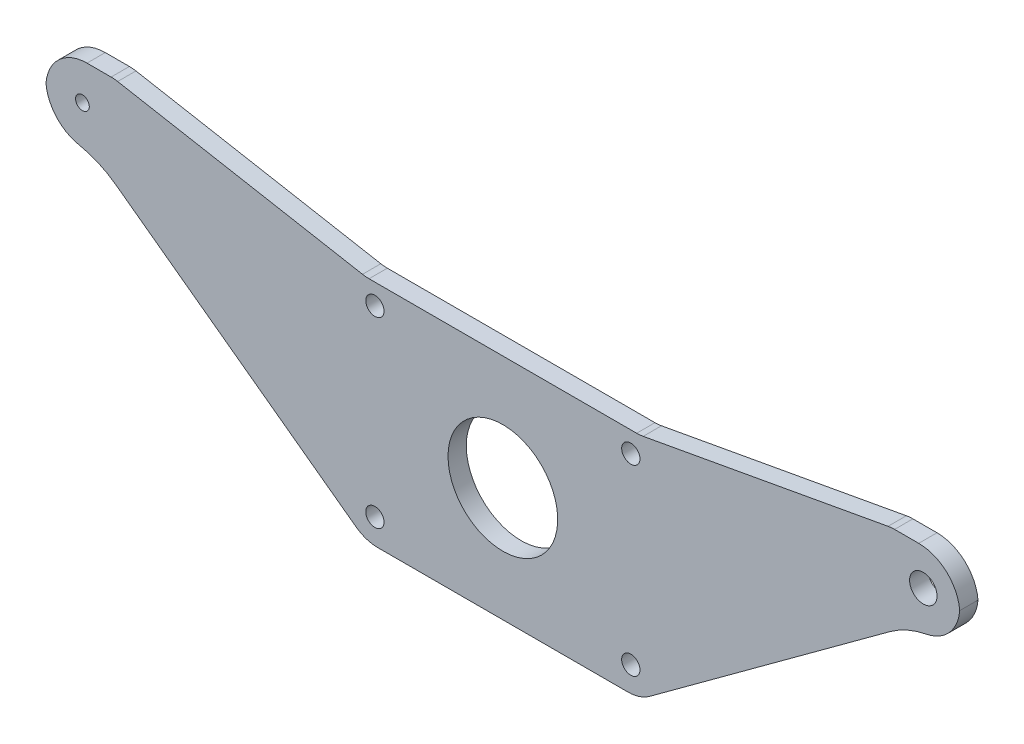
ISO-10303-21;
HEADER;
FILE_DESCRIPTION(('STEP AP214'),'2;1');
FILE_NAME('part.step','',(''),(''),'','','');
FILE_SCHEMA(('AUTOMOTIVE_DESIGN { 1 0 10303 214 1 1 1 1 }'));
ENDSEC;
DATA;
#1=APPLICATION_CONTEXT('core data for automotive mechanical design processes');
#2=APPLICATION_PROTOCOL_DEFINITION('international standard','automotive_design',2000,#1);
#3=PRODUCT_CONTEXT('',#1,'mechanical');
#4=PRODUCT('Part','Part','',(#3));
#5=PRODUCT_RELATED_PRODUCT_CATEGORY('part','',(#4));
#6=PRODUCT_DEFINITION_FORMATION('','',#4);
#7=PRODUCT_DEFINITION_CONTEXT('part definition',#1,'design');
#8=PRODUCT_DEFINITION('design','',#6,#7);
#9=PRODUCT_DEFINITION_SHAPE('','',#8);
#10=(LENGTH_UNIT() NAMED_UNIT(*) SI_UNIT(.MILLI.,.METRE.));
#11=(NAMED_UNIT(*) PLANE_ANGLE_UNIT() SI_UNIT($,.RADIAN.));
#12=(NAMED_UNIT(*) SI_UNIT($,.STERADIAN.) SOLID_ANGLE_UNIT());
#13=UNCERTAINTY_MEASURE_WITH_UNIT(LENGTH_MEASURE(1.E-05),#10,'distance_accuracy_value','');
#14=(GEOMETRIC_REPRESENTATION_CONTEXT(3) GLOBAL_UNCERTAINTY_ASSIGNED_CONTEXT((#13)) GLOBAL_UNIT_ASSIGNED_CONTEXT((#10,
#11,#12)) REPRESENTATION_CONTEXT('',''));
#15=CARTESIAN_POINT('',(0.,0.,0.));
#16=DIRECTION('',(0.,0.,1.));
#17=DIRECTION('',(1.,0.,0.));
#18=AXIS2_PLACEMENT_3D('',#15,#16,#17);
#19=CARTESIAN_POINT('',(-30.,-50.,-4.));
#20=DIRECTION('',(0.591363663627517,0.806404995855706,0.));
#21=DIRECTION('',(-0.806404995855706,0.591363663627517,0.));
#22=AXIS2_PLACEMENT_3D('',#19,#20,#21);
#23=PLANE('',#22);
#24=DIRECTION('',(0.806404995855706,-0.591363663627517,0.));
#25=VECTOR('',#24,1.);
#26=CARTESIAN_POINT('',(-30.,-50.,-4.));
#27=LINE('',#26,#25);
#28=CARTESIAN_POINT('',(-84.7201362506102,-9.87190008288589,-4.));
#29=VERTEX_POINT('',#28);
#30=CARTESIAN_POINT('',(-32.1119454997559,-48.4512399668456,-4.));
#31=VERTEX_POINT('',#30);
#32=EDGE_CURVE('E216',#29,#31,#27,.T.);
#33=ORIENTED_EDGE('',*,*,#32,.T.);
#34=DIRECTION('',(0.,0.,1.));
#35=VECTOR('',#34,1.);
#36=CARTESIAN_POINT('',(-32.1119454997559,-48.4512399668456,-4.));
#37=LINE('',#36,#35);
#38=CARTESIAN_POINT('',(-32.1119454997559,-48.4512399668456,0.));
#39=VERTEX_POINT('',#38);
#40=EDGE_CURVE('E252',#39,#31,#37,.F.);
#41=ORIENTED_EDGE('',*,*,#40,.F.);
#42=DIRECTION('',(0.806404995855706,-0.591363663627517,0.));
#43=VECTOR('',#42,1.);
#44=CARTESIAN_POINT('',(-30.,-50.,0.));
#45=LINE('',#44,#43);
#46=CARTESIAN_POINT('',(-84.7201362506102,-9.87190008288589,0.));
#47=VERTEX_POINT('',#46);
#48=EDGE_CURVE('E348',#47,#39,#45,.T.);
#49=ORIENTED_EDGE('',*,*,#48,.F.);
#50=DIRECTION('',(0.,0.,1.));
#51=VECTOR('',#50,1.);
#52=CARTESIAN_POINT('',(-84.7201362506101,-9.8719000828859,0.));
#53=LINE('',#52,#51);
#54=EDGE_CURVE('E266',#29,#47,#53,.T.);
#55=ORIENTED_EDGE('',*,*,#54,.F.);
#56=EDGE_LOOP('',(#33,#41,#49,#55));
#57=FACE_BOUND('',#56,.T.);
#58=ADVANCED_FACE('F37',(#57),#23,.F.);
#59=CARTESIAN_POINT('',(-30.,-50.,-4.));
#60=DIRECTION('',(0.,1.,0.));
#61=DIRECTION('',(-1.,0.,0.));
#62=AXIS2_PLACEMENT_3D('',#59,#60,#61);
#63=PLANE('',#62);
#64=DIRECTION('',(1.,0.,0.));
#65=VECTOR('',#64,1.);
#66=CARTESIAN_POINT('',(-30.,-50.,-4.));
#67=LINE('',#66,#65);
#68=CARTESIAN_POINT('',(-27.3810361907358,-50.,-4.));
#69=VERTEX_POINT('',#68);
#70=CARTESIAN_POINT('',(27.3810361907358,-50.,-4.));
#71=VERTEX_POINT('',#70);
#72=EDGE_CURVE('E353',#69,#71,#67,.T.);
#73=ORIENTED_EDGE('',*,*,#72,.T.);
#74=DIRECTION('',(0.,0.,1.));
#75=VECTOR('',#74,1.);
#76=CARTESIAN_POINT('',(27.3810361907358,-50.,-4.));
#77=LINE('',#76,#75);
#78=CARTESIAN_POINT('',(27.3810361907358,-50.,0.));
#79=VERTEX_POINT('',#78);
#80=EDGE_CURVE('E246',#79,#71,#77,.F.);
#81=ORIENTED_EDGE('',*,*,#80,.F.);
#82=DIRECTION('',(1.,0.,0.));
#83=VECTOR('',#82,1.);
#84=CARTESIAN_POINT('',(-30.,-50.,0.));
#85=LINE('',#84,#83);
#86=CARTESIAN_POINT('',(-27.3810361907358,-50.,0.));
#87=VERTEX_POINT('',#86);
#88=EDGE_CURVE('E374',#87,#79,#85,.T.);
#89=ORIENTED_EDGE('',*,*,#88,.F.);
#90=DIRECTION('',(0.,0.,1.));
#91=VECTOR('',#90,1.);
#92=CARTESIAN_POINT('',(-27.3810361907358,-50.,-4.));
#93=LINE('',#92,#91);
#94=EDGE_CURVE('E249',#69,#87,#93,.T.);
#95=ORIENTED_EDGE('',*,*,#94,.F.);
#96=EDGE_LOOP('',(#73,#81,#89,#95));
#97=FACE_BOUND('',#96,.T.);
#98=ADVANCED_FACE('F441',(#97),#63,.F.);
#99=CARTESIAN_POINT('',(90.,-5.99999999999997,-4.));
#100=DIRECTION('',(-0.591363663627518,0.806404995855705,0.));
#101=DIRECTION('',(-0.806404995855705,-0.591363663627518,0.));
#102=AXIS2_PLACEMENT_3D('',#99,#100,#101);
#103=PLANE('',#102);
#104=DIRECTION('',(0.806404995855705,0.591363663627518,0.));
#105=VECTOR('',#104,1.);
#106=CARTESIAN_POINT('',(90.,-5.99999999999997,0.));
#107=LINE('',#106,#105);
#108=CARTESIAN_POINT('',(32.111945499756,-48.4512399668456,0.));
#109=VERTEX_POINT('',#108);
#110=CARTESIAN_POINT('',(84.7201362506102,-9.87190008288586,0.));
#111=VERTEX_POINT('',#110);
#112=EDGE_CURVE('E207',#109,#111,#107,.T.);
#113=ORIENTED_EDGE('',*,*,#112,.F.);
#114=DIRECTION('',(0.,0.,1.));
#115=VECTOR('',#114,1.);
#116=CARTESIAN_POINT('',(32.111945499756,-48.4512399668456,-4.));
#117=LINE('',#116,#115);
#118=CARTESIAN_POINT('',(32.111945499756,-48.4512399668456,-4.));
#119=VERTEX_POINT('',#118);
#120=EDGE_CURVE('E255',#119,#109,#117,.T.);
#121=ORIENTED_EDGE('',*,*,#120,.F.);
#122=DIRECTION('',(0.806404995855705,0.591363663627518,0.));
#123=VECTOR('',#122,1.);
#124=CARTESIAN_POINT('',(90.,-5.99999999999997,-4.));
#125=LINE('',#124,#123);
#126=CARTESIAN_POINT('',(84.7201362506102,-9.87190008288586,-4.));
#127=VERTEX_POINT('',#126);
#128=EDGE_CURVE('E356',#119,#127,#125,.T.);
#129=ORIENTED_EDGE('',*,*,#128,.T.);
#130=DIRECTION('',(0.,0.,1.));
#131=VECTOR('',#130,1.);
#132=CARTESIAN_POINT('',(84.7201362506102,-9.87190008288586,-4.));
#133=LINE('',#132,#131);
#134=EDGE_CURVE('E269',#111,#127,#133,.F.);
#135=ORIENTED_EDGE('',*,*,#134,.F.);
#136=EDGE_LOOP('',(#113,#121,#129,#135));
#137=FACE_BOUND('',#136,.T.);
#138=ADVANCED_FACE('F383',(#137),#103,.F.);
#139=CARTESIAN_POINT('',(85.,10.,-4.));
#140=DIRECTION('',(0.,-1.,0.));
#141=DIRECTION('',(1.,0.,0.));
#142=AXIS2_PLACEMENT_3D('',#139,#140,#141);
#143=PLANE('',#142);
#144=DIRECTION('',(-1.,0.,0.));
#145=VECTOR('',#144,1.);
#146=CARTESIAN_POINT('',(85.,10.,-4.));
#147=LINE('',#146,#145);
#148=CARTESIAN_POINT('',(91.,10.,-4.));
#149=VERTEX_POINT('',#148);
#150=CARTESIAN_POINT('',(85.7213595499958,10.,-4.));
#151=VERTEX_POINT('',#150);
#152=EDGE_CURVE('E359',#149,#151,#147,.T.);
#153=ORIENTED_EDGE('',*,*,#152,.T.);
#154=DIRECTION('',(0.,0.,1.));
#155=VECTOR('',#154,1.);
#156=CARTESIAN_POINT('',(85.7213595499958,10.,-4.));
#157=LINE('',#156,#155);
#158=CARTESIAN_POINT('',(85.7213595499958,10.,0.));
#159=VERTEX_POINT('',#158);
#160=EDGE_CURVE('E187',#159,#151,#157,.F.);
#161=ORIENTED_EDGE('',*,*,#160,.F.);
#162=DIRECTION('',(-1.,0.,0.));
#163=VECTOR('',#162,1.);
#164=CARTESIAN_POINT('',(85.,10.,0.));
#165=LINE('',#164,#163);
#166=CARTESIAN_POINT('',(91.,10.,0.));
#167=VERTEX_POINT('',#166);
#168=EDGE_CURVE('E183',#167,#159,#165,.T.);
#169=ORIENTED_EDGE('',*,*,#168,.F.);
#170=DIRECTION('',(0.,0.,1.));
#171=VECTOR('',#170,1.);
#172=CARTESIAN_POINT('',(91.,10.,-4.));
#173=LINE('',#172,#171);
#174=EDGE_CURVE('E301',#149,#167,#173,.T.);
#175=ORIENTED_EDGE('',*,*,#174,.F.);
#176=EDGE_LOOP('',(#153,#161,#169,#175));
#177=FACE_BOUND('',#176,.T.);
#178=ADVANCED_FACE('F395',(#177),#143,.F.);
#179=CARTESIAN_POINT('',(30.,0.,-4.));
#180=DIRECTION('',(0.178885438199984,-0.983869910099907,0.));
#181=DIRECTION('',(0.983869910099907,0.178885438199984,0.));
#182=AXIS2_PLACEMENT_3D('',#179,#180,#181);
#183=PLANE('',#182);
#184=DIRECTION('',(-0.983869910099907,-0.178885438199984,0.));
#185=VECTOR('',#184,1.);
#186=CARTESIAN_POINT('',(30.,0.,-4.));
#187=LINE('',#186,#185);
#188=CARTESIAN_POINT('',(84.2902760443959,9.87095928079929,-4.));
#189=VERTEX_POINT('',#188);
#190=CARTESIAN_POINT('',(30.7097239556041,0.129040719200754,-4.));
#191=VERTEX_POINT('',#190);
#192=EDGE_CURVE('E362',#189,#191,#187,.T.);
#193=ORIENTED_EDGE('',*,*,#192,.T.);
#194=DIRECTION('',(0.,0.,1.));
#195=VECTOR('',#194,1.);
#196=CARTESIAN_POINT('',(30.7097239556041,0.129040719200754,-4.));
#197=LINE('',#196,#195);
#198=CARTESIAN_POINT('',(30.7097239556041,0.129040719200754,0.));
#199=VERTEX_POINT('',#198);
#200=EDGE_CURVE('E198',#199,#191,#197,.F.);
#201=ORIENTED_EDGE('',*,*,#200,.F.);
#202=DIRECTION('',(-0.983869910099907,-0.178885438199984,0.));
#203=VECTOR('',#202,1.);
#204=CARTESIAN_POINT('',(30.,0.,0.));
#205=LINE('',#204,#203);
#206=CARTESIAN_POINT('',(84.2902760443959,9.87095928079929,0.));
#207=VERTEX_POINT('',#206);
#208=EDGE_CURVE('E180',#207,#199,#205,.T.);
#209=ORIENTED_EDGE('',*,*,#208,.F.);
#210=DIRECTION('',(0.,0.,1.));
#211=VECTOR('',#210,1.);
#212=CARTESIAN_POINT('',(84.2902760443959,9.87095928079929,-4.));
#213=LINE('',#212,#211);
#214=EDGE_CURVE('E191',#189,#207,#213,.T.);
#215=ORIENTED_EDGE('',*,*,#214,.F.);
#216=EDGE_LOOP('',(#193,#201,#209,#215));
#217=FACE_BOUND('',#216,.T.);
#218=ADVANCED_FACE('F200',(#217),#183,.F.);
#219=CARTESIAN_POINT('',(-30.,0.,-4.));
#220=DIRECTION('',(0.,-1.,0.));
#221=DIRECTION('',(1.,0.,0.));
#222=AXIS2_PLACEMENT_3D('',#219,#220,#221);
#223=PLANE('',#222);
#224=DIRECTION('',(-1.,0.,0.));
#225=VECTOR('',#224,1.);
#226=CARTESIAN_POINT('',(-30.,0.,-4.));
#227=LINE('',#226,#225);
#228=CARTESIAN_POINT('',(29.2786404500042,0.,-4.));
#229=VERTEX_POINT('',#228);
#230=CARTESIAN_POINT('',(-29.2786404500042,0.,-4.));
#231=VERTEX_POINT('',#230);
#232=EDGE_CURVE('E364',#229,#231,#227,.T.);
#233=ORIENTED_EDGE('',*,*,#232,.T.);
#234=DIRECTION('',(0.,0.,1.));
#235=VECTOR('',#234,1.);
#236=CARTESIAN_POINT('',(-29.2786404500042,0.,-4.));
#237=LINE('',#236,#235);
#238=CARTESIAN_POINT('',(-29.2786404500042,0.,0.));
#239=VERTEX_POINT('',#238);
#240=EDGE_CURVE('E231',#239,#231,#237,.F.);
#241=ORIENTED_EDGE('',*,*,#240,.F.);
#242=DIRECTION('',(-1.,0.,0.));
#243=VECTOR('',#242,1.);
#244=CARTESIAN_POINT('',(-30.,0.,0.));
#245=LINE('',#244,#243);
#246=CARTESIAN_POINT('',(29.2786404500042,0.,0.));
#247=VERTEX_POINT('',#246);
#248=EDGE_CURVE('E202',#247,#239,#245,.T.);
#249=ORIENTED_EDGE('',*,*,#248,.F.);
#250=DIRECTION('',(0.,0.,1.));
#251=VECTOR('',#250,1.);
#252=CARTESIAN_POINT('',(29.2786404500042,0.,0.));
#253=LINE('',#252,#251);
#254=EDGE_CURVE('E234',#229,#247,#253,.T.);
#255=ORIENTED_EDGE('',*,*,#254,.F.);
#256=EDGE_LOOP('',(#233,#241,#249,#255));
#257=FACE_BOUND('',#256,.T.);
#258=ADVANCED_FACE('F405',(#257),#223,.F.);
#259=CARTESIAN_POINT('',(-85.,10.,-4.));
#260=DIRECTION('',(-0.178885438199983,-0.983869910099907,0.));
#261=DIRECTION('',(0.983869910099907,-0.178885438199983,0.));
#262=AXIS2_PLACEMENT_3D('',#259,#260,#261);
#263=PLANE('',#262);
#264=DIRECTION('',(-0.983869910099907,0.178885438199983,0.));
#265=VECTOR('',#264,1.);
#266=CARTESIAN_POINT('',(-85.,10.,0.));
#267=LINE('',#266,#265);
#268=CARTESIAN_POINT('',(-30.7097239556041,0.129040719200741,0.));
#269=VERTEX_POINT('',#268);
#270=CARTESIAN_POINT('',(-84.2902760443959,9.87095928079926,0.));
#271=VERTEX_POINT('',#270);
#272=EDGE_CURVE('E205',#269,#271,#267,.T.);
#273=ORIENTED_EDGE('',*,*,#272,.F.);
#274=DIRECTION('',(0.,0.,1.));
#275=VECTOR('',#274,1.);
#276=CARTESIAN_POINT('',(-30.7097239556041,0.129040719200743,0.));
#277=LINE('',#276,#275);
#278=CARTESIAN_POINT('',(-30.7097239556041,0.129040719200741,-4.));
#279=VERTEX_POINT('',#278);
#280=EDGE_CURVE('E240',#279,#269,#277,.T.);
#281=ORIENTED_EDGE('',*,*,#280,.F.);
#282=DIRECTION('',(-0.983869910099907,0.178885438199983,0.));
#283=VECTOR('',#282,1.);
#284=CARTESIAN_POINT('',(-85.,10.,-4.));
#285=LINE('',#284,#283);
#286=CARTESIAN_POINT('',(-84.2902760443959,9.87095928079926,-4.));
#287=VERTEX_POINT('',#286);
#288=EDGE_CURVE('E367',#279,#287,#285,.T.);
#289=ORIENTED_EDGE('',*,*,#288,.T.);
#290=DIRECTION('',(0.,0.,1.));
#291=VECTOR('',#290,1.);
#292=CARTESIAN_POINT('',(-84.2902760443959,9.87095928079926,-4.));
#293=LINE('',#292,#291);
#294=EDGE_CURVE('E243',#271,#287,#293,.F.);
#295=ORIENTED_EDGE('',*,*,#294,.F.);
#296=EDGE_LOOP('',(#273,#281,#289,#295));
#297=FACE_BOUND('',#296,.T.);
#298=ADVANCED_FACE('F413',(#297),#263,.F.);
#299=CARTESIAN_POINT('',(-100.,10.,-4.));
#300=DIRECTION('',(0.,-1.,0.));
#301=DIRECTION('',(1.,0.,0.));
#302=AXIS2_PLACEMENT_3D('',#299,#300,#301);
#303=PLANE('',#302);
#304=DIRECTION('',(-1.,0.,0.));
#305=VECTOR('',#304,1.);
#306=CARTESIAN_POINT('',(-100.,10.,0.));
#307=LINE('',#306,#305);
#308=CARTESIAN_POINT('',(-85.7213595499958,10.,0.));
#309=VERTEX_POINT('',#308);
#310=CARTESIAN_POINT('',(-91.,10.,0.));
#311=VERTEX_POINT('',#310);
#312=EDGE_CURVE('E213',#309,#311,#307,.T.);
#313=ORIENTED_EDGE('',*,*,#312,.F.);
#314=DIRECTION('',(0.,0.,1.));
#315=VECTOR('',#314,1.);
#316=CARTESIAN_POINT('',(-85.7213595499958,10.,-4.));
#317=LINE('',#316,#315);
#318=CARTESIAN_POINT('',(-85.7213595499958,10.,-4.));
#319=VERTEX_POINT('',#318);
#320=EDGE_CURVE('E237',#319,#309,#317,.T.);
#321=ORIENTED_EDGE('',*,*,#320,.F.);
#322=DIRECTION('',(-1.,0.,0.));
#323=VECTOR('',#322,1.);
#324=CARTESIAN_POINT('',(-100.,10.,-4.));
#325=LINE('',#324,#323);
#326=CARTESIAN_POINT('',(-91.,10.,-4.));
#327=VERTEX_POINT('',#326);
#328=EDGE_CURVE('E217',#319,#327,#325,.T.);
#329=ORIENTED_EDGE('',*,*,#328,.T.);
#330=DIRECTION('',(0.,0.,1.));
#331=VECTOR('',#330,1.);
#332=CARTESIAN_POINT('',(-91.,10.,-4.));
#333=LINE('',#332,#331);
#334=EDGE_CURVE('E11',#311,#327,#333,.F.);
#335=ORIENTED_EDGE('',*,*,#334,.F.);
#336=EDGE_LOOP('',(#313,#321,#329,#335));
#337=FACE_BOUND('',#336,.T.);
#338=ADVANCED_FACE('F422',(#337),#303,.F.);
#339=CARTESIAN_POINT('',(0.,0.,-4.));
#340=DIRECTION('',(0.,0.,1.));
#341=DIRECTION('',(-1.,0.,0.));
#342=AXIS2_PLACEMENT_3D('',#339,#340,#341);
#343=PLANE('',#342);
#344=CARTESIAN_POINT('',(92.,2.,-4.));
#345=DIRECTION('',(0.,0.,-1.));
#346=DIRECTION('',(-1.,0.,0.));
#347=AXIS2_PLACEMENT_3D('',#344,#345,#346);
#348=CIRCLE('',#347,3.00000000000001);
#349=CARTESIAN_POINT('',(89.,2.,-4.));
#350=VERTEX_POINT('',#349);
#351=EDGE_CURVE('E308',#350,#350,#348,.T.);
#352=ORIENTED_EDGE('',*,*,#351,.F.);
#353=EDGE_LOOP('',(#352));
#354=FACE_BOUND('',#353,.T.);
#355=CARTESIAN_POINT('',(-92.,2.,-4.));
#356=DIRECTION('',(0.,0.,-1.));
#357=DIRECTION('',(-1.,0.,0.));
#358=AXIS2_PLACEMENT_3D('',#355,#356,#357);
#359=CIRCLE('',#358,1.5);
#360=CARTESIAN_POINT('',(-93.5,2.,-4.));
#361=VERTEX_POINT('',#360);
#362=EDGE_CURVE('E306',#361,#361,#359,.T.);
#363=ORIENTED_EDGE('',*,*,#362,.F.);
#364=EDGE_LOOP('',(#363));
#365=FACE_BOUND('',#364,.T.);
#366=CARTESIAN_POINT('',(-28.,-44.5,-4.));
#367=DIRECTION('',(0.,0.,1.));
#368=DIRECTION('',(1.,0.,0.));
#369=AXIS2_PLACEMENT_3D('',#366,#367,#368);
#370=CIRCLE('',#369,2.00000000000001);
#371=CARTESIAN_POINT('',(-26.,-44.5,-4.));
#372=VERTEX_POINT('',#371);
#373=EDGE_CURVE('E321',#372,#372,#370,.T.);
#374=ORIENTED_EDGE('',*,*,#373,.T.);
#375=EDGE_LOOP('',(#374));
#376=FACE_BOUND('',#375,.T.);
#377=CARTESIAN_POINT('',(-28.,-4.49999999999999,-4.));
#378=DIRECTION('',(0.,0.,1.));
#379=DIRECTION('',(1.,0.,0.));
#380=AXIS2_PLACEMENT_3D('',#377,#378,#379);
#381=CIRCLE('',#380,2.);
#382=CARTESIAN_POINT('',(-26.,-4.49999999999999,-4.));
#383=VERTEX_POINT('',#382);
#384=EDGE_CURVE('E327',#383,#383,#381,.T.);
#385=ORIENTED_EDGE('',*,*,#384,.T.);
#386=EDGE_LOOP('',(#385));
#387=FACE_BOUND('',#386,.T.);
#388=CARTESIAN_POINT('',(0.,-25.,-4.));
#389=DIRECTION('',(0.,0.,-1.));
#390=DIRECTION('',(-1.,0.,0.));
#391=AXIS2_PLACEMENT_3D('',#388,#389,#390);
#392=CIRCLE('',#391,12.);
#393=CARTESIAN_POINT('',(-12.,-25.,-4.));
#394=VERTEX_POINT('',#393);
#395=EDGE_CURVE('E333',#394,#394,#392,.T.);
#396=ORIENTED_EDGE('',*,*,#395,.F.);
#397=EDGE_LOOP('',(#396));
#398=FACE_BOUND('',#397,.T.);
#399=CARTESIAN_POINT('',(28.,-44.5,-4.));
#400=DIRECTION('',(0.,0.,-1.));
#401=DIRECTION('',(-1.,0.,0.));
#402=AXIS2_PLACEMENT_3D('',#399,#400,#401);
#403=CIRCLE('',#402,2.00000000000001);
#404=CARTESIAN_POINT('',(26.,-44.5,-4.));
#405=VERTEX_POINT('',#404);
#406=EDGE_CURVE('E336',#405,#405,#403,.T.);
#407=ORIENTED_EDGE('',*,*,#406,.F.);
#408=EDGE_LOOP('',(#407));
#409=FACE_BOUND('',#408,.T.);
#410=CARTESIAN_POINT('',(28.,-4.49999999999999,-4.));
#411=DIRECTION('',(0.,0.,-1.));
#412=DIRECTION('',(-1.,0.,0.));
#413=AXIS2_PLACEMENT_3D('',#410,#411,#412);
#414=CIRCLE('',#413,2.);
#415=CARTESIAN_POINT('',(26.,-4.49999999999999,-4.));
#416=VERTEX_POINT('',#415);
#417=EDGE_CURVE('E345',#416,#416,#414,.T.);
#418=ORIENTED_EDGE('',*,*,#417,.F.);
#419=EDGE_LOOP('',(#418));
#420=FACE_BOUND('',#419,.T.);
#421=CARTESIAN_POINT('',(96.5474095231605,-26.,-4.));
#422=DIRECTION('',(0.,0.,-1.));
#423=DIRECTION('',(-1.,0.,0.));
#424=AXIS2_PLACEMENT_3D('',#421,#422,#423);
#425=CIRCLE('',#424,20.);
#426=CARTESIAN_POINT('',(92.7216098520153,-6.36932866975083,-4.));
#427=VERTEX_POINT('',#426);
#428=EDGE_CURVE('E279',#127,#427,#425,.T.);
#429=ORIENTED_EDGE('',*,*,#428,.F.);
#430=ORIENTED_EDGE('',*,*,#128,.F.);
#431=CARTESIAN_POINT('',(27.3810361907358,-42.,-4.));
#432=DIRECTION('',(0.,0.,-1.));
#433=DIRECTION('',(-1.,0.,0.));
#434=AXIS2_PLACEMENT_3D('',#431,#432,#433);
#435=CIRCLE('',#434,8.);
#436=EDGE_CURVE('E224',#71,#119,#435,.F.);
#437=ORIENTED_EDGE('',*,*,#436,.F.);
#438=ORIENTED_EDGE('',*,*,#72,.F.);
#439=CARTESIAN_POINT('',(-27.3810361907358,-42.,-4.));
#440=DIRECTION('',(0.,0.,-1.));
#441=DIRECTION('',(-1.,0.,0.));
#442=AXIS2_PLACEMENT_3D('',#439,#440,#441);
#443=CIRCLE('',#442,8.);
#444=EDGE_CURVE('E226',#31,#69,#443,.F.);
#445=ORIENTED_EDGE('',*,*,#444,.F.);
#446=ORIENTED_EDGE('',*,*,#32,.F.);
#447=CARTESIAN_POINT('',(-96.5474095231605,-26.,-4.));
#448=DIRECTION('',(0.,0.,-1.));
#449=DIRECTION('',(-1.,0.,0.));
#450=AXIS2_PLACEMENT_3D('',#447,#448,#449);
#451=CIRCLE('',#450,20.);
#452=CARTESIAN_POINT('',(-92.7216098520153,-6.36932866975086,-4.));
#453=VERTEX_POINT('',#452);
#454=EDGE_CURVE('E275',#453,#29,#451,.T.);
#455=ORIENTED_EDGE('',*,*,#454,.F.);
#456=CARTESIAN_POINT('',(-91.,2.46447342886125,-4.));
#457=DIRECTION('',(0.,0.,-1.));
#458=DIRECTION('',(-1.,0.,0.));
#459=AXIS2_PLACEMENT_3D('',#456,#457,#458);
#460=CIRCLE('',#459,9.);
#461=CARTESIAN_POINT('',(-99.9701632869218,1.73223671443063,-4.));
#462=VERTEX_POINT('',#461);
#463=EDGE_CURVE('E295',#462,#453,#460,.F.);
#464=ORIENTED_EDGE('',*,*,#463,.F.);
#465=CARTESIAN_POINT('',(-91.,1.,-4.));
#466=DIRECTION('',(0.,0.,-1.));
#467=DIRECTION('',(-1.,0.,0.));
#468=AXIS2_PLACEMENT_3D('',#465,#466,#467);
#469=CIRCLE('',#468,9.);
#470=EDGE_CURVE('E293',#327,#462,#469,.F.);
#471=ORIENTED_EDGE('',*,*,#470,.F.);
#472=ORIENTED_EDGE('',*,*,#328,.F.);
#473=CARTESIAN_POINT('',(-85.7213595499958,2.,-4.));
#474=DIRECTION('',(0.,0.,-1.));
#475=DIRECTION('',(-1.,0.,0.));
#476=AXIS2_PLACEMENT_3D('',#473,#474,#475);
#477=CIRCLE('',#476,8.);
#478=EDGE_CURVE('E228',#287,#319,#477,.F.);
#479=ORIENTED_EDGE('',*,*,#478,.F.);
#480=ORIENTED_EDGE('',*,*,#288,.F.);
#481=CARTESIAN_POINT('',(-29.2786404500042,8.,-4.));
#482=DIRECTION('',(0.,0.,-1.));
#483=DIRECTION('',(-1.,0.,0.));
#484=AXIS2_PLACEMENT_3D('',#481,#482,#483);
#485=CIRCLE('',#484,8.);
#486=EDGE_CURVE('E264',#231,#279,#485,.T.);
#487=ORIENTED_EDGE('',*,*,#486,.F.);
#488=ORIENTED_EDGE('',*,*,#232,.F.);
#489=CARTESIAN_POINT('',(29.2786404500042,8.00000000000001,-4.));
#490=DIRECTION('',(0.,0.,-1.));
#491=DIRECTION('',(-1.,0.,0.));
#492=AXIS2_PLACEMENT_3D('',#489,#490,#491);
#493=CIRCLE('',#492,8.);
#494=EDGE_CURVE('E260',#191,#229,#493,.T.);
#495=ORIENTED_EDGE('',*,*,#494,.F.);
#496=ORIENTED_EDGE('',*,*,#192,.F.);
#497=CARTESIAN_POINT('',(85.7213595499958,2.00000000000003,-4.));
#498=DIRECTION('',(0.,0.,-1.));
#499=DIRECTION('',(-1.,0.,0.));
#500=AXIS2_PLACEMENT_3D('',#497,#498,#499);
#501=CIRCLE('',#500,8.);
#502=EDGE_CURVE('E193',#151,#189,#501,.F.);
#503=ORIENTED_EDGE('',*,*,#502,.F.);
#504=ORIENTED_EDGE('',*,*,#152,.F.);
#505=CARTESIAN_POINT('',(91.,1.00000000000003,-4.));
#506=DIRECTION('',(0.,0.,-1.));
#507=DIRECTION('',(-1.,0.,0.));
#508=AXIS2_PLACEMENT_3D('',#505,#506,#507);
#509=CIRCLE('',#508,9.);
#510=CARTESIAN_POINT('',(99.9701632869218,1.73223671443066,-4.));
#511=VERTEX_POINT('',#510);
#512=EDGE_CURVE('E297',#511,#149,#509,.F.);
#513=ORIENTED_EDGE('',*,*,#512,.F.);
#514=CARTESIAN_POINT('',(91.,2.46447342886128,-4.));
#515=DIRECTION('',(0.,0.,-1.));
#516=DIRECTION('',(-1.,0.,0.));
#517=AXIS2_PLACEMENT_3D('',#514,#515,#516);
#518=CIRCLE('',#517,9.);
#519=EDGE_CURVE('E299',#427,#511,#518,.F.);
#520=ORIENTED_EDGE('',*,*,#519,.F.);
#521=EDGE_LOOP('',(#429,#430,#437,#438,#445,#446,#455,#464,#471,#472,#479,#480,#487,#488,#495,
#496,#503,#504,#513,#520));
#522=FACE_BOUND('',#521,.T.);
#523=ADVANCED_FACE('F397',(#354,#365,#376,#387,#398,#409,#420,#522),#343,.F.);
#524=CARTESIAN_POINT('',(0.,0.,0.));
#525=DIRECTION('',(0.,0.,1.));
#526=DIRECTION('',(-1.,0.,0.));
#527=AXIS2_PLACEMENT_3D('',#524,#525,#526);
#528=PLANE('',#527);
#529=CARTESIAN_POINT('',(92.,2.,0.));
#530=DIRECTION('',(0.,0.,-1.));
#531=DIRECTION('',(-1.,0.,0.));
#532=AXIS2_PLACEMENT_3D('',#529,#530,#531);
#533=CIRCLE('',#532,3.00000000000001);
#534=CARTESIAN_POINT('',(89.,2.,0.));
#535=VERTEX_POINT('',#534);
#536=EDGE_CURVE('E311',#535,#535,#533,.T.);
#537=ORIENTED_EDGE('',*,*,#536,.T.);
#538=EDGE_LOOP('',(#537));
#539=FACE_BOUND('',#538,.T.);
#540=CARTESIAN_POINT('',(-92.,2.,0.));
#541=DIRECTION('',(0.,0.,-1.));
#542=DIRECTION('',(-1.,0.,0.));
#543=AXIS2_PLACEMENT_3D('',#540,#541,#542);
#544=CIRCLE('',#543,1.5);
#545=CARTESIAN_POINT('',(-93.5,2.,0.));
#546=VERTEX_POINT('',#545);
#547=EDGE_CURVE('E304',#546,#546,#544,.T.);
#548=ORIENTED_EDGE('',*,*,#547,.T.);
#549=EDGE_LOOP('',(#548));
#550=FACE_BOUND('',#549,.T.);
#551=CARTESIAN_POINT('',(-28.,-44.5,0.));
#552=DIRECTION('',(0.,0.,1.));
#553=DIRECTION('',(1.,0.,0.));
#554=AXIS2_PLACEMENT_3D('',#551,#552,#553);
#555=CIRCLE('',#554,2.00000000000001);
#556=CARTESIAN_POINT('',(-26.,-44.5,0.));
#557=VERTEX_POINT('',#556);
#558=EDGE_CURVE('E319',#557,#557,#555,.T.);
#559=ORIENTED_EDGE('',*,*,#558,.F.);
#560=EDGE_LOOP('',(#559));
#561=FACE_BOUND('',#560,.T.);
#562=CARTESIAN_POINT('',(-28.,-4.49999999999999,0.));
#563=DIRECTION('',(0.,0.,1.));
#564=DIRECTION('',(1.,0.,0.));
#565=AXIS2_PLACEMENT_3D('',#562,#563,#564);
#566=CIRCLE('',#565,2.);
#567=CARTESIAN_POINT('',(-26.,-4.49999999999999,0.));
#568=VERTEX_POINT('',#567);
#569=EDGE_CURVE('E324',#568,#568,#566,.T.);
#570=ORIENTED_EDGE('',*,*,#569,.F.);
#571=EDGE_LOOP('',(#570));
#572=FACE_BOUND('',#571,.T.);
#573=CARTESIAN_POINT('',(0.,-25.,0.));
#574=DIRECTION('',(0.,0.,-1.));
#575=DIRECTION('',(-1.,0.,0.));
#576=AXIS2_PLACEMENT_3D('',#573,#574,#575);
#577=CIRCLE('',#576,12.);
#578=CARTESIAN_POINT('',(-12.,-25.,0.));
#579=VERTEX_POINT('',#578);
#580=EDGE_CURVE('E330',#579,#579,#577,.T.);
#581=ORIENTED_EDGE('',*,*,#580,.T.);
#582=EDGE_LOOP('',(#581));
#583=FACE_BOUND('',#582,.T.);
#584=CARTESIAN_POINT('',(28.,-44.5,0.));
#585=DIRECTION('',(0.,0.,-1.));
#586=DIRECTION('',(-1.,0.,0.));
#587=AXIS2_PLACEMENT_3D('',#584,#585,#586);
#588=CIRCLE('',#587,2.00000000000001);
#589=CARTESIAN_POINT('',(26.,-44.5,0.));
#590=VERTEX_POINT('',#589);
#591=EDGE_CURVE('E339',#590,#590,#588,.T.);
#592=ORIENTED_EDGE('',*,*,#591,.T.);
#593=EDGE_LOOP('',(#592));
#594=FACE_BOUND('',#593,.T.);
#595=CARTESIAN_POINT('',(28.,-4.49999999999999,0.));
#596=DIRECTION('',(0.,0.,-1.));
#597=DIRECTION('',(-1.,0.,0.));
#598=AXIS2_PLACEMENT_3D('',#595,#596,#597);
#599=CIRCLE('',#598,2.);
#600=CARTESIAN_POINT('',(26.,-4.49999999999999,0.));
#601=VERTEX_POINT('',#600);
#602=EDGE_CURVE('E342',#601,#601,#599,.T.);
#603=ORIENTED_EDGE('',*,*,#602,.T.);
#604=EDGE_LOOP('',(#603));
#605=FACE_BOUND('',#604,.T.);
#606=CARTESIAN_POINT('',(91.,1.00000000000003,0.));
#607=DIRECTION('',(0.,0.,-1.));
#608=DIRECTION('',(-1.,0.,0.));
#609=AXIS2_PLACEMENT_3D('',#606,#607,#608);
#610=CIRCLE('',#609,9.);
#611=CARTESIAN_POINT('',(99.9701632869218,1.73223671443066,0.));
#612=VERTEX_POINT('',#611);
#613=EDGE_CURVE('E286',#167,#612,#610,.T.);
#614=ORIENTED_EDGE('',*,*,#613,.F.);
#615=ORIENTED_EDGE('',*,*,#168,.T.);
#616=CARTESIAN_POINT('',(85.7213595499958,2.00000000000003,0.));
#617=DIRECTION('',(0.,0.,-1.));
#618=DIRECTION('',(-1.,0.,0.));
#619=AXIS2_PLACEMENT_3D('',#616,#617,#618);
#620=CIRCLE('',#619,8.);
#621=EDGE_CURVE('E176',#207,#159,#620,.T.);
#622=ORIENTED_EDGE('',*,*,#621,.F.);
#623=ORIENTED_EDGE('',*,*,#208,.T.);
#624=CARTESIAN_POINT('',(29.2786404500042,8.00000000000001,0.));
#625=DIRECTION('',(0.,0.,-1.));
#626=DIRECTION('',(-1.,0.,0.));
#627=AXIS2_PLACEMENT_3D('',#624,#625,#626);
#628=CIRCLE('',#627,8.);
#629=EDGE_CURVE('E258',#247,#199,#628,.F.);
#630=ORIENTED_EDGE('',*,*,#629,.F.);
#631=ORIENTED_EDGE('',*,*,#248,.T.);
#632=CARTESIAN_POINT('',(-29.2786404500042,8.,0.));
#633=DIRECTION('',(0.,0.,-1.));
#634=DIRECTION('',(-1.,0.,0.));
#635=AXIS2_PLACEMENT_3D('',#632,#633,#634);
#636=CIRCLE('',#635,8.);
#637=EDGE_CURVE('E262',#269,#239,#636,.F.);
#638=ORIENTED_EDGE('',*,*,#637,.F.);
#639=ORIENTED_EDGE('',*,*,#272,.T.);
#640=CARTESIAN_POINT('',(-85.7213595499958,2.,0.));
#641=DIRECTION('',(0.,0.,-1.));
#642=DIRECTION('',(-1.,0.,0.));
#643=AXIS2_PLACEMENT_3D('',#640,#641,#642);
#644=CIRCLE('',#643,8.);
#645=EDGE_CURVE('E188',#309,#271,#644,.T.);
#646=ORIENTED_EDGE('',*,*,#645,.F.);
#647=ORIENTED_EDGE('',*,*,#312,.T.);
#648=CARTESIAN_POINT('',(-91.,1.,0.));
#649=DIRECTION('',(0.,0.,-1.));
#650=DIRECTION('',(-1.,0.,0.));
#651=AXIS2_PLACEMENT_3D('',#648,#649,#650);
#652=CIRCLE('',#651,9.);
#653=CARTESIAN_POINT('',(-99.9701632869218,1.73223671443063,0.));
#654=VERTEX_POINT('',#653);
#655=EDGE_CURVE('E282',#654,#311,#652,.T.);
#656=ORIENTED_EDGE('',*,*,#655,.F.);
#657=CARTESIAN_POINT('',(-91.,2.46447342886125,0.));
#658=DIRECTION('',(0.,0.,-1.));
#659=DIRECTION('',(-1.,0.,0.));
#660=AXIS2_PLACEMENT_3D('',#657,#658,#659);
#661=CIRCLE('',#660,9.);
#662=CARTESIAN_POINT('',(-92.7216098520153,-6.36932866975086,0.));
#663=VERTEX_POINT('',#662);
#664=EDGE_CURVE('E284',#663,#654,#661,.T.);
#665=ORIENTED_EDGE('',*,*,#664,.F.);
#666=CARTESIAN_POINT('',(-96.5474095231605,-26.,0.));
#667=DIRECTION('',(0.,0.,-1.));
#668=DIRECTION('',(-1.,0.,0.));
#669=AXIS2_PLACEMENT_3D('',#666,#667,#668);
#670=CIRCLE('',#669,20.);
#671=EDGE_CURVE('E272',#47,#663,#670,.F.);
#672=ORIENTED_EDGE('',*,*,#671,.F.);
#673=ORIENTED_EDGE('',*,*,#48,.T.);
#674=CARTESIAN_POINT('',(-27.3810361907358,-42.,0.));
#675=DIRECTION('',(0.,0.,-1.));
#676=DIRECTION('',(-1.,0.,0.));
#677=AXIS2_PLACEMENT_3D('',#674,#675,#676);
#678=CIRCLE('',#677,8.);
#679=EDGE_CURVE('E220',#87,#39,#678,.T.);
#680=ORIENTED_EDGE('',*,*,#679,.F.);
#681=ORIENTED_EDGE('',*,*,#88,.T.);
#682=CARTESIAN_POINT('',(27.3810361907358,-42.,0.));
#683=DIRECTION('',(0.,0.,-1.));
#684=DIRECTION('',(-1.,0.,0.));
#685=AXIS2_PLACEMENT_3D('',#682,#683,#684);
#686=CIRCLE('',#685,8.);
#687=EDGE_CURVE('E197',#109,#79,#686,.T.);
#688=ORIENTED_EDGE('',*,*,#687,.F.);
#689=ORIENTED_EDGE('',*,*,#112,.T.);
#690=CARTESIAN_POINT('',(96.5474095231605,-26.,0.));
#691=DIRECTION('',(0.,0.,-1.));
#692=DIRECTION('',(-1.,0.,0.));
#693=AXIS2_PLACEMENT_3D('',#690,#691,#692);
#694=CIRCLE('',#693,20.);
#695=CARTESIAN_POINT('',(92.7216098520153,-6.36932866975083,0.));
#696=VERTEX_POINT('',#695);
#697=EDGE_CURVE('E277',#696,#111,#694,.F.);
#698=ORIENTED_EDGE('',*,*,#697,.F.);
#699=CARTESIAN_POINT('',(91.,2.46447342886128,0.));
#700=DIRECTION('',(0.,0.,-1.));
#701=DIRECTION('',(-1.,0.,0.));
#702=AXIS2_PLACEMENT_3D('',#699,#700,#701);
#703=CIRCLE('',#702,9.);
#704=EDGE_CURVE('E288',#612,#696,#703,.T.);
#705=ORIENTED_EDGE('',*,*,#704,.F.);
#706=EDGE_LOOP('',(#614,#615,#622,#623,#630,#631,#638,#639,#646,#647,#656,#665,#672,#673,#680,
#681,#688,#689,#698,#705));
#707=FACE_BOUND('',#706,.T.);
#708=ADVANCED_FACE('F178',(#539,#550,#561,#572,#583,#594,#605,#707),#528,.T.);
#709=CARTESIAN_POINT('',(85.7213595499958,2.00000000000003,-4.));
#710=DIRECTION('',(0.,0.,1.));
#711=DIRECTION('',(-1.,0.,0.));
#712=AXIS2_PLACEMENT_3D('',#709,#710,#711);
#713=CYLINDRICAL_SURFACE('',#712,8.);
#714=ORIENTED_EDGE('',*,*,#502,.T.);
#715=ORIENTED_EDGE('',*,*,#214,.T.);
#716=ORIENTED_EDGE('',*,*,#621,.T.);
#717=ORIENTED_EDGE('',*,*,#160,.T.);
#718=EDGE_LOOP('',(#714,#715,#716,#717));
#719=FACE_BOUND('',#718,.T.);
#720=ADVANCED_FACE('F192',(#719),#713,.T.);
#721=CARTESIAN_POINT('',(29.2786404500042,8.00000000000001,-4.));
#722=DIRECTION('',(0.,0.,-1.));
#723=DIRECTION('',(1.,0.,0.));
#724=AXIS2_PLACEMENT_3D('',#721,#722,#723);
#725=CYLINDRICAL_SURFACE('',#724,8.);
#726=ORIENTED_EDGE('',*,*,#494,.T.);
#727=ORIENTED_EDGE('',*,*,#254,.T.);
#728=ORIENTED_EDGE('',*,*,#629,.T.);
#729=ORIENTED_EDGE('',*,*,#200,.T.);
#730=EDGE_LOOP('',(#726,#727,#728,#729));
#731=FACE_BOUND('',#730,.T.);
#732=ADVANCED_FACE('F401',(#731),#725,.F.);
#733=CARTESIAN_POINT('',(-85.7213595499958,2.,-4.));
#734=DIRECTION('',(0.,0.,1.));
#735=DIRECTION('',(-1.,0.,0.));
#736=AXIS2_PLACEMENT_3D('',#733,#734,#735);
#737=CYLINDRICAL_SURFACE('',#736,8.);
#738=ORIENTED_EDGE('',*,*,#478,.T.);
#739=ORIENTED_EDGE('',*,*,#320,.T.);
#740=ORIENTED_EDGE('',*,*,#645,.T.);
#741=ORIENTED_EDGE('',*,*,#294,.T.);
#742=EDGE_LOOP('',(#738,#739,#740,#741));
#743=FACE_BOUND('',#742,.T.);
#744=ADVANCED_FACE('F418',(#743),#737,.T.);
#745=CARTESIAN_POINT('',(-29.2786404500042,8.,-4.));
#746=DIRECTION('',(0.,0.,-1.));
#747=DIRECTION('',(1.,0.,0.));
#748=AXIS2_PLACEMENT_3D('',#745,#746,#747);
#749=CYLINDRICAL_SURFACE('',#748,8.);
#750=ORIENTED_EDGE('',*,*,#486,.T.);
#751=ORIENTED_EDGE('',*,*,#280,.T.);
#752=ORIENTED_EDGE('',*,*,#637,.T.);
#753=ORIENTED_EDGE('',*,*,#240,.T.);
#754=EDGE_LOOP('',(#750,#751,#752,#753));
#755=FACE_BOUND('',#754,.T.);
#756=ADVANCED_FACE('F407',(#755),#749,.F.);
#757=CARTESIAN_POINT('',(-27.3810361907358,-42.,-4.));
#758=DIRECTION('',(0.,0.,1.));
#759=DIRECTION('',(-1.,0.,0.));
#760=AXIS2_PLACEMENT_3D('',#757,#758,#759);
#761=CYLINDRICAL_SURFACE('',#760,8.);
#762=ORIENTED_EDGE('',*,*,#444,.T.);
#763=ORIENTED_EDGE('',*,*,#94,.T.);
#764=ORIENTED_EDGE('',*,*,#679,.T.);
#765=ORIENTED_EDGE('',*,*,#40,.T.);
#766=EDGE_LOOP('',(#762,#763,#764,#765));
#767=FACE_BOUND('',#766,.T.);
#768=ADVANCED_FACE('F438',(#767),#761,.T.);
#769=CARTESIAN_POINT('',(27.3810361907358,-42.,-4.));
#770=DIRECTION('',(0.,0.,1.));
#771=DIRECTION('',(-1.,0.,0.));
#772=AXIS2_PLACEMENT_3D('',#769,#770,#771);
#773=CYLINDRICAL_SURFACE('',#772,8.);
#774=ORIENTED_EDGE('',*,*,#436,.T.);
#775=ORIENTED_EDGE('',*,*,#120,.T.);
#776=ORIENTED_EDGE('',*,*,#687,.T.);
#777=ORIENTED_EDGE('',*,*,#80,.T.);
#778=EDGE_LOOP('',(#774,#775,#776,#777));
#779=FACE_BOUND('',#778,.T.);
#780=ADVANCED_FACE('F443',(#779),#773,.T.);
#781=CARTESIAN_POINT('',(-96.5474095231605,-26.,-4.));
#782=DIRECTION('',(0.,0.,-1.));
#783=DIRECTION('',(1.,0.,0.));
#784=AXIS2_PLACEMENT_3D('',#781,#782,#783);
#785=CYLINDRICAL_SURFACE('',#784,20.);
#786=ORIENTED_EDGE('',*,*,#454,.T.);
#787=ORIENTED_EDGE('',*,*,#54,.T.);
#788=ORIENTED_EDGE('',*,*,#671,.T.);
#789=DIRECTION('',(0.,0.,-1.));
#790=VECTOR('',#789,1.);
#791=CARTESIAN_POINT('',(-92.7216098520153,-6.36932866975086,-4.));
#792=LINE('',#791,#790);
#793=EDGE_CURVE('E46',#453,#663,#792,.F.);
#794=ORIENTED_EDGE('',*,*,#793,.F.);
#795=EDGE_LOOP('',(#786,#787,#788,#794));
#796=FACE_BOUND('',#795,.T.);
#797=ADVANCED_FACE('F428',(#796),#785,.F.);
#798=CARTESIAN_POINT('',(96.5474095231605,-26.,-4.));
#799=DIRECTION('',(0.,0.,-1.));
#800=DIRECTION('',(1.,0.,0.));
#801=AXIS2_PLACEMENT_3D('',#798,#799,#800);
#802=CYLINDRICAL_SURFACE('',#801,20.);
#803=ORIENTED_EDGE('',*,*,#697,.T.);
#804=ORIENTED_EDGE('',*,*,#134,.T.);
#805=ORIENTED_EDGE('',*,*,#428,.T.);
#806=DIRECTION('',(0.,0.,-1.));
#807=VECTOR('',#806,1.);
#808=CARTESIAN_POINT('',(92.7216098520153,-6.36932866975083,-4.));
#809=LINE('',#808,#807);
#810=EDGE_CURVE('E291',#696,#427,#809,.T.);
#811=ORIENTED_EDGE('',*,*,#810,.F.);
#812=EDGE_LOOP('',(#803,#804,#805,#811));
#813=FACE_BOUND('',#812,.T.);
#814=ADVANCED_FACE('F386',(#813),#802,.F.);
#815=CARTESIAN_POINT('',(28.,-4.49999999999999,-4.));
#816=DIRECTION('',(0.,0.,1.));
#817=DIRECTION('',(-1.,0.,0.));
#818=AXIS2_PLACEMENT_3D('',#815,#816,#817);
#819=CYLINDRICAL_SURFACE('',#818,2.);
#820=ORIENTED_EDGE('',*,*,#417,.T.);
#821=EDGE_LOOP('',(#820));
#822=FACE_BOUND('',#821,.T.);
#823=ORIENTED_EDGE('',*,*,#602,.F.);
#824=EDGE_LOOP('',(#823));
#825=FACE_BOUND('',#824,.T.);
#826=ADVANCED_FACE('F494',(#822,#825),#819,.F.);
#827=CARTESIAN_POINT('',(28.,-44.5,-4.));
#828=DIRECTION('',(0.,0.,1.));
#829=DIRECTION('',(-1.,0.,0.));
#830=AXIS2_PLACEMENT_3D('',#827,#828,#829);
#831=CYLINDRICAL_SURFACE('',#830,2.00000000000001);
#832=ORIENTED_EDGE('',*,*,#406,.T.);
#833=EDGE_LOOP('',(#832));
#834=FACE_BOUND('',#833,.T.);
#835=ORIENTED_EDGE('',*,*,#591,.F.);
#836=EDGE_LOOP('',(#835));
#837=FACE_BOUND('',#836,.T.);
#838=ADVANCED_FACE('F503',(#834,#837),#831,.F.);
#839=CARTESIAN_POINT('',(0.,-25.,-4.));
#840=DIRECTION('',(0.,0.,1.));
#841=DIRECTION('',(-1.,0.,0.));
#842=AXIS2_PLACEMENT_3D('',#839,#840,#841);
#843=CYLINDRICAL_SURFACE('',#842,12.);
#844=ORIENTED_EDGE('',*,*,#395,.T.);
#845=EDGE_LOOP('',(#844));
#846=FACE_BOUND('',#845,.T.);
#847=ORIENTED_EDGE('',*,*,#580,.F.);
#848=EDGE_LOOP('',(#847));
#849=FACE_BOUND('',#848,.T.);
#850=ADVANCED_FACE('F513',(#846,#849),#843,.F.);
#851=CARTESIAN_POINT('',(-28.,-4.49999999999999,-4.));
#852=DIRECTION('',(0.,0.,1.));
#853=DIRECTION('',(-1.,0.,0.));
#854=AXIS2_PLACEMENT_3D('',#851,#852,#853);
#855=CYLINDRICAL_SURFACE('',#854,2.);
#856=ORIENTED_EDGE('',*,*,#384,.F.);
#857=EDGE_LOOP('',(#856));
#858=FACE_BOUND('',#857,.T.);
#859=ORIENTED_EDGE('',*,*,#569,.T.);
#860=EDGE_LOOP('',(#859));
#861=FACE_BOUND('',#860,.T.);
#862=ADVANCED_FACE('F523',(#858,#861),#855,.F.);
#863=CARTESIAN_POINT('',(-28.,-44.5,-4.));
#864=DIRECTION('',(0.,0.,1.));
#865=DIRECTION('',(-1.,0.,0.));
#866=AXIS2_PLACEMENT_3D('',#863,#864,#865);
#867=CYLINDRICAL_SURFACE('',#866,2.00000000000001);
#868=ORIENTED_EDGE('',*,*,#373,.F.);
#869=EDGE_LOOP('',(#868));
#870=FACE_BOUND('',#869,.T.);
#871=ORIENTED_EDGE('',*,*,#558,.T.);
#872=EDGE_LOOP('',(#871));
#873=FACE_BOUND('',#872,.T.);
#874=ADVANCED_FACE('F533',(#870,#873),#867,.F.);
#875=CARTESIAN_POINT('',(-92.,2.,-4.));
#876=DIRECTION('',(0.,0.,1.));
#877=DIRECTION('',(-1.,0.,0.));
#878=AXIS2_PLACEMENT_3D('',#875,#876,#877);
#879=CYLINDRICAL_SURFACE('',#878,1.5);
#880=ORIENTED_EDGE('',*,*,#362,.T.);
#881=EDGE_LOOP('',(#880));
#882=FACE_BOUND('',#881,.T.);
#883=ORIENTED_EDGE('',*,*,#547,.F.);
#884=EDGE_LOOP('',(#883));
#885=FACE_BOUND('',#884,.T.);
#886=ADVANCED_FACE('F543',(#882,#885),#879,.F.);
#887=CARTESIAN_POINT('',(91.,1.00000000000003,-4.));
#888=DIRECTION('',(0.,0.,1.));
#889=DIRECTION('',(-1.,0.,0.));
#890=AXIS2_PLACEMENT_3D('',#887,#888,#889);
#891=CYLINDRICAL_SURFACE('',#890,9.);
#892=ORIENTED_EDGE('',*,*,#174,.T.);
#893=ORIENTED_EDGE('',*,*,#613,.T.);
#894=DIRECTION('',(0.,0.,1.));
#895=VECTOR('',#894,1.);
#896=CARTESIAN_POINT('',(99.9701632869218,1.73223671443066,-2.));
#897=LINE('',#896,#895);
#898=EDGE_CURVE('E54',#612,#511,#897,.F.);
#899=ORIENTED_EDGE('',*,*,#898,.T.);
#900=ORIENTED_EDGE('',*,*,#512,.T.);
#901=EDGE_LOOP('',(#892,#893,#899,#900));
#902=FACE_BOUND('',#901,.T.);
#903=ADVANCED_FACE('F390',(#902),#891,.T.);
#904=CARTESIAN_POINT('',(91.,2.46447342886128,-4.));
#905=DIRECTION('',(0.,0.,-1.));
#906=DIRECTION('',(1.,0.,0.));
#907=AXIS2_PLACEMENT_3D('',#904,#905,#906);
#908=CYLINDRICAL_SURFACE('',#907,9.);
#909=ORIENTED_EDGE('',*,*,#519,.T.);
#910=ORIENTED_EDGE('',*,*,#898,.F.);
#911=ORIENTED_EDGE('',*,*,#704,.T.);
#912=ORIENTED_EDGE('',*,*,#810,.T.);
#913=EDGE_LOOP('',(#909,#910,#911,#912));
#914=FACE_BOUND('',#913,.T.);
#915=ADVANCED_FACE('F389',(#914),#908,.T.);
#916=CARTESIAN_POINT('',(-91.,1.,-4.));
#917=DIRECTION('',(0.,0.,1.));
#918=DIRECTION('',(-1.,0.,0.));
#919=AXIS2_PLACEMENT_3D('',#916,#917,#918);
#920=CYLINDRICAL_SURFACE('',#919,9.);
#921=DIRECTION('',(0.,0.,1.));
#922=VECTOR('',#921,1.);
#923=CARTESIAN_POINT('',(-99.9701632869218,1.73223671443063,-2.));
#924=LINE('',#923,#922);
#925=EDGE_CURVE('E41',#462,#654,#924,.T.);
#926=ORIENTED_EDGE('',*,*,#925,.T.);
#927=ORIENTED_EDGE('',*,*,#655,.T.);
#928=ORIENTED_EDGE('',*,*,#334,.T.);
#929=ORIENTED_EDGE('',*,*,#470,.T.);
#930=EDGE_LOOP('',(#926,#927,#928,#929));
#931=FACE_BOUND('',#930,.T.);
#932=ADVANCED_FACE('F39',(#931),#920,.T.);
#933=CARTESIAN_POINT('',(-91.,2.46447342886125,-4.));
#934=DIRECTION('',(0.,0.,-1.));
#935=DIRECTION('',(1.,0.,0.));
#936=AXIS2_PLACEMENT_3D('',#933,#934,#935);
#937=CYLINDRICAL_SURFACE('',#936,9.);
#938=ORIENTED_EDGE('',*,*,#463,.T.);
#939=ORIENTED_EDGE('',*,*,#793,.T.);
#940=ORIENTED_EDGE('',*,*,#664,.T.);
#941=ORIENTED_EDGE('',*,*,#925,.F.);
#942=EDGE_LOOP('',(#938,#939,#940,#941));
#943=FACE_BOUND('',#942,.T.);
#944=ADVANCED_FACE('F425',(#943),#937,.T.);
#945=CARTESIAN_POINT('',(92.,2.,-25.));
#946=DIRECTION('',(0.,0.,1.));
#947=DIRECTION('',(-1.,0.,0.));
#948=AXIS2_PLACEMENT_3D('',#945,#946,#947);
#949=CYLINDRICAL_SURFACE('',#948,3.00000000000001);
#950=ORIENTED_EDGE('',*,*,#536,.F.);
#951=EDGE_LOOP('',(#950));
#952=FACE_BOUND('',#951,.T.);
#953=ORIENTED_EDGE('',*,*,#351,.T.);
#954=EDGE_LOOP('',(#953));
#955=FACE_BOUND('',#954,.T.);
#956=ADVANCED_FACE('F585',(#952,#955),#949,.F.);
#957=CLOSED_SHELL('',(#58,#98,#138,#178,#218,#258,#298,#338,#523,#708,#720,#732,#744,#756,#768,
#780,#797,#814,#826,#838,#850,#862,#874,#886,#903,#915,#932,#944,#956));
#958=MANIFOLD_SOLID_BREP('B2',#957);
#959=ADVANCED_BREP_SHAPE_REPRESENTATION('',(#18,#958),#14);
#960=SHAPE_DEFINITION_REPRESENTATION(#9,#959);
ENDSEC;
END-ISO-10303-21;
